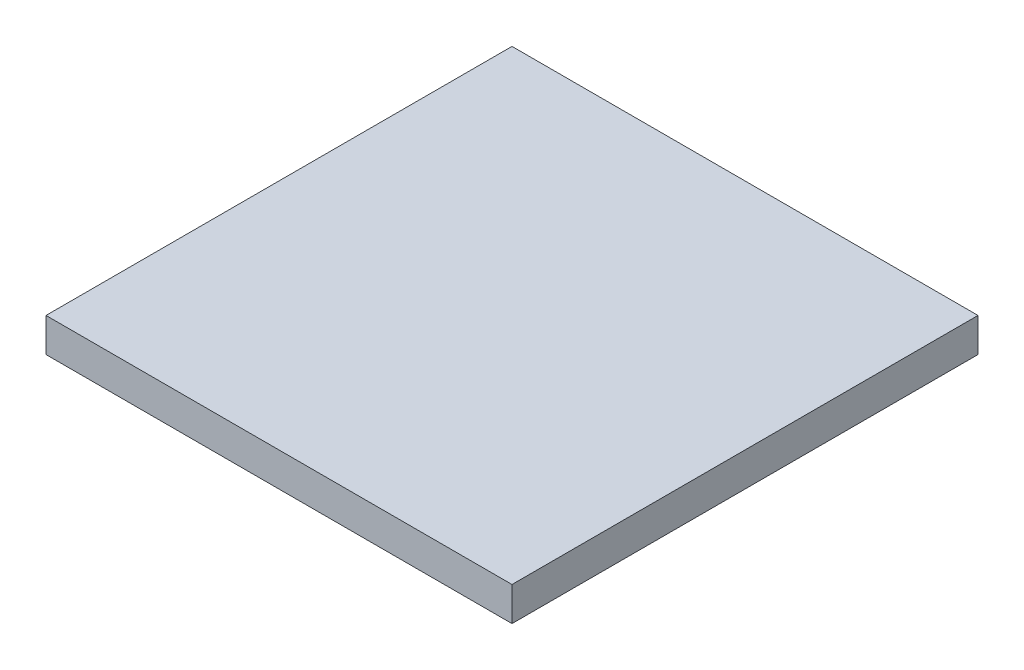
ISO-10303-21;
HEADER;
FILE_DESCRIPTION(('STEP AP214'),'2;1');
FILE_NAME('part.step','',(''),(''),'','','');
FILE_SCHEMA(('AUTOMOTIVE_DESIGN { 1 0 10303 214 1 1 1 1 }'));
ENDSEC;
DATA;
#1=APPLICATION_CONTEXT('core data for automotive mechanical design processes');
#2=APPLICATION_PROTOCOL_DEFINITION('international standard','automotive_design',2000,#1);
#3=PRODUCT_CONTEXT('',#1,'mechanical');
#4=PRODUCT('Part','Part','',(#3));
#5=PRODUCT_RELATED_PRODUCT_CATEGORY('part','',(#4));
#6=PRODUCT_DEFINITION_FORMATION('','',#4);
#7=PRODUCT_DEFINITION_CONTEXT('part definition',#1,'design');
#8=PRODUCT_DEFINITION('design','',#6,#7);
#9=PRODUCT_DEFINITION_SHAPE('','',#8);
#10=(LENGTH_UNIT() NAMED_UNIT(*) SI_UNIT(.MILLI.,.METRE.));
#11=(NAMED_UNIT(*) PLANE_ANGLE_UNIT() SI_UNIT($,.RADIAN.));
#12=(NAMED_UNIT(*) SI_UNIT($,.STERADIAN.) SOLID_ANGLE_UNIT());
#13=UNCERTAINTY_MEASURE_WITH_UNIT(LENGTH_MEASURE(1.E-05),#10,'distance_accuracy_value','');
#14=(GEOMETRIC_REPRESENTATION_CONTEXT(3) GLOBAL_UNCERTAINTY_ASSIGNED_CONTEXT((#13)) GLOBAL_UNIT_ASSIGNED_CONTEXT((#10,
#11,#12)) REPRESENTATION_CONTEXT('',''));
#15=CARTESIAN_POINT('',(0.,0.,0.));
#16=DIRECTION('',(0.,0.,1.));
#17=DIRECTION('',(1.,0.,0.));
#18=AXIS2_PLACEMENT_3D('',#15,#16,#17);
#19=CARTESIAN_POINT('',(13.75,2.,-13.75));
#20=DIRECTION('',(-1.,0.,0.));
#21=DIRECTION('',(0.,0.,1.));
#22=AXIS2_PLACEMENT_3D('',#19,#20,#21);
#23=PLANE('',#22);
#24=DIRECTION('',(0.,0.,-1.));
#25=VECTOR('',#24,1.);
#26=CARTESIAN_POINT('',(13.75,0.,-13.75));
#27=LINE('',#26,#25);
#28=CARTESIAN_POINT('',(13.75,0.,13.75));
#29=VERTEX_POINT('',#28);
#30=CARTESIAN_POINT('',(13.75,0.,-13.75));
#31=VERTEX_POINT('',#30);
#32=EDGE_CURVE('E95',#29,#31,#27,.T.);
#33=ORIENTED_EDGE('',*,*,#32,.T.);
#34=DIRECTION('',(0.,-1.,0.));
#35=VECTOR('',#34,1.);
#36=CARTESIAN_POINT('',(13.75,2.,-13.75));
#37=LINE('',#36,#35);
#38=CARTESIAN_POINT('',(13.75,2.,-13.75));
#39=VERTEX_POINT('',#38);
#40=EDGE_CURVE('E11',#39,#31,#37,.T.);
#41=ORIENTED_EDGE('',*,*,#40,.F.);
#42=DIRECTION('',(0.,0.,-1.));
#43=VECTOR('',#42,1.);
#44=CARTESIAN_POINT('',(13.75,2.,-13.75));
#45=LINE('',#44,#43);
#46=CARTESIAN_POINT('',(13.75,2.,13.75));
#47=VERTEX_POINT('',#46);
#48=EDGE_CURVE('E83',#47,#39,#45,.T.);
#49=ORIENTED_EDGE('',*,*,#48,.F.);
#50=DIRECTION('',(0.,-1.,0.));
#51=VECTOR('',#50,1.);
#52=CARTESIAN_POINT('',(13.75,2.,13.75));
#53=LINE('',#52,#51);
#54=EDGE_CURVE('E91',#47,#29,#53,.T.);
#55=ORIENTED_EDGE('',*,*,#54,.T.);
#56=EDGE_LOOP('',(#33,#41,#49,#55));
#57=FACE_BOUND('',#56,.T.);
#58=ADVANCED_FACE('F32',(#57),#23,.F.);
#59=CARTESIAN_POINT('',(-13.75,2.,-13.75));
#60=DIRECTION('',(0.,0.,1.));
#61=DIRECTION('',(1.,0.,0.));
#62=AXIS2_PLACEMENT_3D('',#59,#60,#61);
#63=PLANE('',#62);
#64=DIRECTION('',(-1.,0.,0.));
#65=VECTOR('',#64,1.);
#66=CARTESIAN_POINT('',(-13.75,0.,-13.75));
#67=LINE('',#66,#65);
#68=CARTESIAN_POINT('',(-13.75,0.,-13.75));
#69=VERTEX_POINT('',#68);
#70=EDGE_CURVE('E87',#31,#69,#67,.T.);
#71=ORIENTED_EDGE('',*,*,#70,.T.);
#72=DIRECTION('',(0.,-1.,0.));
#73=VECTOR('',#72,1.);
#74=CARTESIAN_POINT('',(-13.75,2.,-13.75));
#75=LINE('',#74,#73);
#76=CARTESIAN_POINT('',(-13.75,2.,-13.75));
#77=VERTEX_POINT('',#76);
#78=EDGE_CURVE('E40',#77,#69,#75,.T.);
#79=ORIENTED_EDGE('',*,*,#78,.F.);
#80=DIRECTION('',(-1.,0.,0.));
#81=VECTOR('',#80,1.);
#82=CARTESIAN_POINT('',(-13.75,2.,-13.75));
#83=LINE('',#82,#81);
#84=EDGE_CURVE('E78',#39,#77,#83,.T.);
#85=ORIENTED_EDGE('',*,*,#84,.F.);
#86=ORIENTED_EDGE('',*,*,#40,.T.);
#87=EDGE_LOOP('',(#71,#79,#85,#86));
#88=FACE_BOUND('',#87,.T.);
#89=ADVANCED_FACE('F86',(#88),#63,.F.);
#90=CARTESIAN_POINT('',(-13.75,2.,-13.75));
#91=DIRECTION('',(1.,0.,0.));
#92=DIRECTION('',(0.,0.,-1.));
#93=AXIS2_PLACEMENT_3D('',#90,#91,#92);
#94=PLANE('',#93);
#95=DIRECTION('',(0.,0.,1.));
#96=VECTOR('',#95,1.);
#97=CARTESIAN_POINT('',(-13.75,0.,-13.75));
#98=LINE('',#97,#96);
#99=CARTESIAN_POINT('',(-13.75,0.,13.75));
#100=VERTEX_POINT('',#99);
#101=EDGE_CURVE('E65',#69,#100,#98,.T.);
#102=ORIENTED_EDGE('',*,*,#101,.T.);
#103=DIRECTION('',(0.,-1.,0.));
#104=VECTOR('',#103,1.);
#105=CARTESIAN_POINT('',(-13.75,2.,13.75));
#106=LINE('',#105,#104);
#107=CARTESIAN_POINT('',(-13.75,2.,13.75));
#108=VERTEX_POINT('',#107);
#109=EDGE_CURVE('E88',#108,#100,#106,.T.);
#110=ORIENTED_EDGE('',*,*,#109,.F.);
#111=DIRECTION('',(0.,0.,1.));
#112=VECTOR('',#111,1.);
#113=CARTESIAN_POINT('',(-13.75,2.,-13.75));
#114=LINE('',#113,#112);
#115=EDGE_CURVE('E81',#77,#108,#114,.T.);
#116=ORIENTED_EDGE('',*,*,#115,.F.);
#117=ORIENTED_EDGE('',*,*,#78,.T.);
#118=EDGE_LOOP('',(#102,#110,#116,#117));
#119=FACE_BOUND('',#118,.T.);
#120=ADVANCED_FACE('F89',(#119),#94,.F.);
#121=CARTESIAN_POINT('',(-13.75,2.,13.75));
#122=DIRECTION('',(0.,0.,-1.));
#123=DIRECTION('',(-1.,0.,0.));
#124=AXIS2_PLACEMENT_3D('',#121,#122,#123);
#125=PLANE('',#124);
#126=DIRECTION('',(1.,0.,0.));
#127=VECTOR('',#126,1.);
#128=CARTESIAN_POINT('',(-13.75,0.,13.75));
#129=LINE('',#128,#127);
#130=EDGE_CURVE('E71',#100,#29,#129,.T.);
#131=ORIENTED_EDGE('',*,*,#130,.T.);
#132=ORIENTED_EDGE('',*,*,#54,.F.);
#133=DIRECTION('',(1.,0.,0.));
#134=VECTOR('',#133,1.);
#135=CARTESIAN_POINT('',(-13.75,2.,13.75));
#136=LINE('',#135,#134);
#137=EDGE_CURVE('E48',#108,#47,#136,.T.);
#138=ORIENTED_EDGE('',*,*,#137,.F.);
#139=ORIENTED_EDGE('',*,*,#109,.T.);
#140=EDGE_LOOP('',(#131,#132,#138,#139));
#141=FACE_BOUND('',#140,.T.);
#142=ADVANCED_FACE('F102',(#141),#125,.F.);
#143=CARTESIAN_POINT('',(0.,2.,0.));
#144=DIRECTION('',(0.,1.,0.));
#145=DIRECTION('',(0.,0.,1.));
#146=AXIS2_PLACEMENT_3D('',#143,#144,#145);
#147=PLANE('',#146);
#148=ORIENTED_EDGE('',*,*,#48,.T.);
#149=ORIENTED_EDGE('',*,*,#84,.T.);
#150=ORIENTED_EDGE('',*,*,#115,.T.);
#151=ORIENTED_EDGE('',*,*,#137,.T.);
#152=EDGE_LOOP('',(#148,#149,#150,#151));
#153=FACE_BOUND('',#152,.T.);
#154=ADVANCED_FACE('F79',(#153),#147,.T.);
#155=CARTESIAN_POINT('',(0.,0.,0.));
#156=DIRECTION('',(0.,1.,0.));
#157=DIRECTION('',(0.,0.,1.));
#158=AXIS2_PLACEMENT_3D('',#155,#156,#157);
#159=PLANE('',#158);
#160=ORIENTED_EDGE('',*,*,#32,.F.);
#161=ORIENTED_EDGE('',*,*,#130,.F.);
#162=ORIENTED_EDGE('',*,*,#101,.F.);
#163=ORIENTED_EDGE('',*,*,#70,.F.);
#164=EDGE_LOOP('',(#160,#161,#162,#163));
#165=FACE_BOUND('',#164,.T.);
#166=ADVANCED_FACE('F105',(#165),#159,.F.);
#167=CLOSED_SHELL('',(#58,#89,#120,#142,#154,#166));
#168=MANIFOLD_SOLID_BREP('B2',#167);
#169=ADVANCED_BREP_SHAPE_REPRESENTATION('',(#18,#168),#14);
#170=SHAPE_DEFINITION_REPRESENTATION(#9,#169);
ENDSEC;
END-ISO-10303-21;
